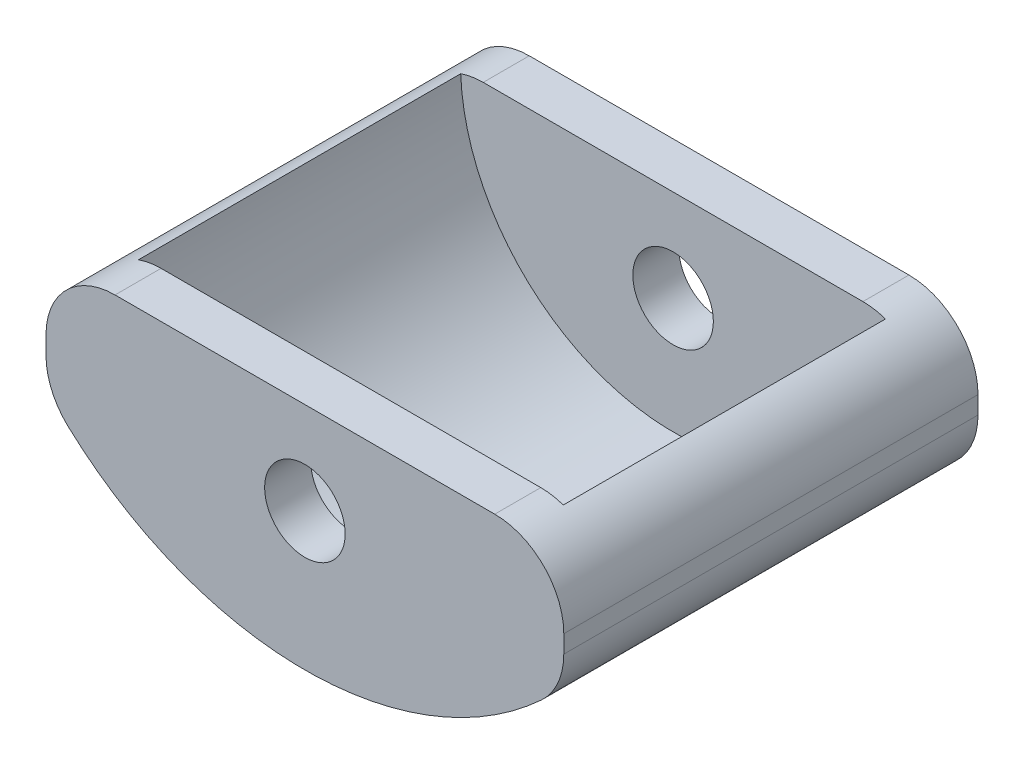
ISO-10303-21;
HEADER;
FILE_DESCRIPTION(('STEP AP214'),'2;1');
FILE_NAME('part.step','',(''),(''),'','','');
FILE_SCHEMA(('AUTOMOTIVE_DESIGN { 1 0 10303 214 1 1 1 1 }'));
ENDSEC;
DATA;
#1=APPLICATION_CONTEXT('core data for automotive mechanical design processes');
#2=APPLICATION_PROTOCOL_DEFINITION('international standard','automotive_design',2000,#1);
#3=PRODUCT_CONTEXT('',#1,'mechanical');
#4=PRODUCT('Part','Part','',(#3));
#5=PRODUCT_RELATED_PRODUCT_CATEGORY('part','',(#4));
#6=PRODUCT_DEFINITION_FORMATION('','',#4);
#7=PRODUCT_DEFINITION_CONTEXT('part definition',#1,'design');
#8=PRODUCT_DEFINITION('design','',#6,#7);
#9=PRODUCT_DEFINITION_SHAPE('','',#8);
#10=(LENGTH_UNIT() NAMED_UNIT(*) SI_UNIT(.MILLI.,.METRE.));
#11=(NAMED_UNIT(*) PLANE_ANGLE_UNIT() SI_UNIT($,.RADIAN.));
#12=(NAMED_UNIT(*) SI_UNIT($,.STERADIAN.) SOLID_ANGLE_UNIT());
#13=UNCERTAINTY_MEASURE_WITH_UNIT(LENGTH_MEASURE(1.E-05),#10,'distance_accuracy_value','');
#14=(GEOMETRIC_REPRESENTATION_CONTEXT(3) GLOBAL_UNCERTAINTY_ASSIGNED_CONTEXT((#13)) GLOBAL_UNIT_ASSIGNED_CONTEXT((#10,
#11,#12)) REPRESENTATION_CONTEXT('',''));
#15=CARTESIAN_POINT('',(0.,0.,0.));
#16=DIRECTION('',(0.,0.,1.));
#17=DIRECTION('',(1.,0.,0.));
#18=AXIS2_PLACEMENT_3D('',#15,#16,#17);
#19=CARTESIAN_POINT('',(0.,10.,0.));
#20=DIRECTION('',(0.,1.,0.));
#21=DIRECTION('',(0.,0.,1.));
#22=AXIS2_PLACEMENT_3D('',#19,#20,#21);
#23=PLANE('',#22);
#24=DIRECTION('',(1.,0.,0.));
#25=VECTOR('',#24,1.);
#26=CARTESIAN_POINT('',(-11.25,10.,9.));
#27=LINE('',#26,#25);
#28=CARTESIAN_POINT('',(-8.25,10.,9.));
#29=VERTEX_POINT('',#28);
#30=CARTESIAN_POINT('',(8.24999999999999,10.,9.));
#31=VERTEX_POINT('',#30);
#32=EDGE_CURVE('E210',#29,#31,#27,.T.);
#33=ORIENTED_EDGE('',*,*,#32,.T.);
#34=DIRECTION('',(0.,0.,-1.));
#35=VECTOR('',#34,1.);
#36=CARTESIAN_POINT('',(8.25,10.,-9.));
#37=LINE('',#36,#35);
#38=CARTESIAN_POINT('',(8.25,10.,7.));
#39=VERTEX_POINT('',#38);
#40=EDGE_CURVE('E182',#31,#39,#37,.T.);
#41=ORIENTED_EDGE('',*,*,#40,.T.);
#42=DIRECTION('',(1.,0.,0.));
#43=VECTOR('',#42,1.);
#44=CARTESIAN_POINT('',(0.,10.,7.));
#45=LINE('',#44,#43);
#46=CARTESIAN_POINT('',(-8.25,10.,7.));
#47=VERTEX_POINT('',#46);
#48=EDGE_CURVE('E212',#47,#39,#45,.T.);
#49=ORIENTED_EDGE('',*,*,#48,.F.);
#50=DIRECTION('',(0.,0.,1.));
#51=VECTOR('',#50,1.);
#52=CARTESIAN_POINT('',(-8.25,10.,9.));
#53=LINE('',#52,#51);
#54=EDGE_CURVE('E175',#47,#29,#53,.T.);
#55=ORIENTED_EDGE('',*,*,#54,.T.);
#56=EDGE_LOOP('',(#33,#41,#49,#55));
#57=FACE_BOUND('',#56,.T.);
#58=ADVANCED_FACE('F35',(#57),#23,.T.);
#59=CARTESIAN_POINT('',(0.,6.,-9.));
#60=DIRECTION('',(0.,0.,1.));
#61=DIRECTION('',(1.,0.,0.));
#62=AXIS2_PLACEMENT_3D('',#59,#60,#61);
#63=CYLINDRICAL_SURFACE('',#62,1.75);
#64=CARTESIAN_POINT('',(0.,6.,9.));
#65=DIRECTION('',(0.,0.,-1.));
#66=DIRECTION('',(-1.,0.,0.));
#67=AXIS2_PLACEMENT_3D('',#64,#65,#66);
#68=CIRCLE('',#67,1.75);
#69=CARTESIAN_POINT('',(-1.75,6.,9.));
#70=VERTEX_POINT('',#69);
#71=EDGE_CURVE('E220',#70,#70,#68,.T.);
#72=ORIENTED_EDGE('',*,*,#71,.F.);
#73=EDGE_LOOP('',(#72));
#74=FACE_BOUND('',#73,.T.);
#75=CARTESIAN_POINT('',(0.,6.,7.));
#76=DIRECTION('',(0.,0.,1.));
#77=DIRECTION('',(1.,0.,0.));
#78=AXIS2_PLACEMENT_3D('',#75,#76,#77);
#79=CIRCLE('',#78,1.75);
#80=CARTESIAN_POINT('',(1.75,6.,7.));
#81=VERTEX_POINT('',#80);
#82=EDGE_CURVE('E236',#81,#81,#79,.F.);
#83=ORIENTED_EDGE('',*,*,#82,.T.);
#84=EDGE_LOOP('',(#83));
#85=FACE_BOUND('',#84,.T.);
#86=ADVANCED_FACE('F250',(#74,#85),#63,.F.);
#87=DIRECTION('',(1.,0.,0.));
#88=VECTOR('',#87,1.);
#89=CARTESIAN_POINT('',(0.,10.,-7.));
#90=LINE('',#89,#88);
#91=CARTESIAN_POINT('',(-8.25000000000001,10.,-7.));
#92=VERTEX_POINT('',#91);
#93=CARTESIAN_POINT('',(8.25,10.,-7.));
#94=VERTEX_POINT('',#93);
#95=EDGE_CURVE('E291',#92,#94,#90,.T.);
#96=ORIENTED_EDGE('',*,*,#95,.T.);
#97=DIRECTION('',(0.,0.,-1.));
#98=VECTOR('',#97,1.);
#99=CARTESIAN_POINT('',(8.25,10.,-9.));
#100=LINE('',#99,#98);
#101=CARTESIAN_POINT('',(8.24999999999999,10.,-9.));
#102=VERTEX_POINT('',#101);
#103=EDGE_CURVE('E180',#94,#102,#100,.T.);
#104=ORIENTED_EDGE('',*,*,#103,.T.);
#105=DIRECTION('',(-1.,0.,0.));
#106=VECTOR('',#105,1.);
#107=CARTESIAN_POINT('',(-11.25,10.,-9.));
#108=LINE('',#107,#106);
#109=CARTESIAN_POINT('',(-8.25000000000001,10.,-9.));
#110=VERTEX_POINT('',#109);
#111=EDGE_CURVE('E219',#102,#110,#108,.T.);
#112=ORIENTED_EDGE('',*,*,#111,.T.);
#113=DIRECTION('',(0.,0.,1.));
#114=VECTOR('',#113,1.);
#115=CARTESIAN_POINT('',(-8.25,10.,9.));
#116=LINE('',#115,#114);
#117=EDGE_CURVE('E177',#110,#92,#116,.T.);
#118=ORIENTED_EDGE('',*,*,#117,.T.);
#119=EDGE_LOOP('',(#96,#104,#112,#118));
#120=FACE_BOUND('',#119,.T.);
#121=ADVANCED_FACE('F247',(#120),#23,.T.);
#122=CARTESIAN_POINT('',(0.,6.,-9.));
#123=DIRECTION('',(0.,0.,1.));
#124=DIRECTION('',(1.,0.,0.));
#125=AXIS2_PLACEMENT_3D('',#122,#123,#124);
#126=CIRCLE('',#125,1.75);
#127=CARTESIAN_POINT('',(1.75,6.,-9.));
#128=VERTEX_POINT('',#127);
#129=EDGE_CURVE('E146',#128,#128,#126,.T.);
#130=ORIENTED_EDGE('',*,*,#129,.F.);
#131=EDGE_LOOP('',(#130));
#132=FACE_BOUND('',#131,.T.);
#133=CARTESIAN_POINT('',(0.,6.,-7.));
#134=DIRECTION('',(0.,0.,1.));
#135=DIRECTION('',(1.,0.,0.));
#136=AXIS2_PLACEMENT_3D('',#133,#134,#135);
#137=CIRCLE('',#136,1.75);
#138=CARTESIAN_POINT('',(1.75,6.,-7.));
#139=VERTEX_POINT('',#138);
#140=EDGE_CURVE('E154',#139,#139,#137,.F.);
#141=ORIENTED_EDGE('',*,*,#140,.F.);
#142=EDGE_LOOP('',(#141));
#143=FACE_BOUND('',#142,.T.);
#144=ADVANCED_FACE('F244',(#132,#143),#63,.F.);
#145=CARTESIAN_POINT('',(-11.25,10.,-9.));
#146=DIRECTION('',(1.,0.,0.));
#147=DIRECTION('',(0.,0.,-1.));
#148=AXIS2_PLACEMENT_3D('',#145,#146,#147);
#149=PLANE('',#148);
#150=DIRECTION('',(0.,-1.,0.));
#151=VECTOR('',#150,1.);
#152=CARTESIAN_POINT('',(-11.25,10.,-9.));
#153=LINE('',#152,#151);
#154=CARTESIAN_POINT('',(-11.25,7.,-9.));
#155=VERTEX_POINT('',#154);
#156=CARTESIAN_POINT('',(-11.25,6.2307542689532,-9.));
#157=VERTEX_POINT('',#156);
#158=EDGE_CURVE('E223',#155,#157,#153,.T.);
#159=ORIENTED_EDGE('',*,*,#158,.T.);
#160=DIRECTION('',(0.,0.,1.));
#161=VECTOR('',#160,1.);
#162=CARTESIAN_POINT('',(-11.25,6.2307542689532,-9.));
#163=LINE('',#162,#161);
#164=CARTESIAN_POINT('',(-11.25,6.2307542689532,9.));
#165=VERTEX_POINT('',#164);
#166=EDGE_CURVE('E172',#157,#165,#163,.T.);
#167=ORIENTED_EDGE('',*,*,#166,.T.);
#168=DIRECTION('',(0.,-1.,0.));
#169=VECTOR('',#168,1.);
#170=CARTESIAN_POINT('',(-11.25,10.,9.));
#171=LINE('',#170,#169);
#172=CARTESIAN_POINT('',(-11.25,7.,9.));
#173=VERTEX_POINT('',#172);
#174=EDGE_CURVE('E234',#173,#165,#171,.T.);
#175=ORIENTED_EDGE('',*,*,#174,.F.);
#176=DIRECTION('',(0.,0.,1.));
#177=VECTOR('',#176,1.);
#178=CARTESIAN_POINT('',(-11.25,7.,-9.));
#179=LINE('',#178,#177);
#180=EDGE_CURVE('E134',#173,#155,#179,.F.);
#181=ORIENTED_EDGE('',*,*,#180,.T.);
#182=EDGE_LOOP('',(#159,#167,#175,#181));
#183=FACE_BOUND('',#182,.T.);
#184=ADVANCED_FACE('F246',(#183),#149,.F.);
#185=CARTESIAN_POINT('',(-11.25,10.,9.));
#186=DIRECTION('',(0.,0.,-1.));
#187=DIRECTION('',(-1.,0.,0.));
#188=AXIS2_PLACEMENT_3D('',#185,#186,#187);
#189=PLANE('',#188);
#190=ORIENTED_EDGE('',*,*,#71,.T.);
#191=EDGE_LOOP('',(#190));
#192=FACE_BOUND('',#191,.T.);
#193=CARTESIAN_POINT('',(0.,15.1866132264529,9.));
#194=DIRECTION('',(0.,0.,1.));
#195=DIRECTION('',(1.,0.,0.));
#196=AXIS2_PLACEMENT_3D('',#193,#194,#195);
#197=CIRCLE('',#196,15.1766132264529);
#198=CARTESIAN_POINT('',(10.2825848854452,4.02426414129347,9.));
#199=VERTEX_POINT('',#198);
#200=CARTESIAN_POINT('',(-10.2825848854452,4.02426414129347,9.));
#201=VERTEX_POINT('',#200);
#202=EDGE_CURVE('E145',#199,#201,#197,.F.);
#203=ORIENTED_EDGE('',*,*,#202,.F.);
#204=CARTESIAN_POINT('',(8.25,6.2307542689532,9.));
#205=DIRECTION('',(0.,0.,-1.));
#206=DIRECTION('',(-1.,0.,0.));
#207=AXIS2_PLACEMENT_3D('',#204,#205,#206);
#208=CIRCLE('',#207,3.);
#209=CARTESIAN_POINT('',(11.25,6.2307542689532,9.));
#210=VERTEX_POINT('',#209);
#211=EDGE_CURVE('E149',#199,#210,#208,.F.);
#212=ORIENTED_EDGE('',*,*,#211,.T.);
#213=DIRECTION('',(0.,-1.,0.));
#214=VECTOR('',#213,1.);
#215=CARTESIAN_POINT('',(11.25,10.,9.));
#216=LINE('',#215,#214);
#217=CARTESIAN_POINT('',(11.25,7.,9.));
#218=VERTEX_POINT('',#217);
#219=EDGE_CURVE('E231',#218,#210,#216,.T.);
#220=ORIENTED_EDGE('',*,*,#219,.F.);
#221=CARTESIAN_POINT('',(8.25,7.,9.));
#222=DIRECTION('',(0.,0.,-1.));
#223=DIRECTION('',(-1.,0.,0.));
#224=AXIS2_PLACEMENT_3D('',#221,#222,#223);
#225=CIRCLE('',#224,3.);
#226=EDGE_CURVE('E152',#218,#31,#225,.F.);
#227=ORIENTED_EDGE('',*,*,#226,.T.);
#228=ORIENTED_EDGE('',*,*,#32,.F.);
#229=CARTESIAN_POINT('',(-8.25,7.,9.));
#230=DIRECTION('',(0.,0.,-1.));
#231=DIRECTION('',(-1.,0.,0.));
#232=AXIS2_PLACEMENT_3D('',#229,#230,#231);
#233=CIRCLE('',#232,3.);
#234=EDGE_CURVE('E150',#29,#173,#233,.F.);
#235=ORIENTED_EDGE('',*,*,#234,.T.);
#236=ORIENTED_EDGE('',*,*,#174,.T.);
#237=CARTESIAN_POINT('',(-8.25,6.2307542689532,9.));
#238=DIRECTION('',(0.,0.,-1.));
#239=DIRECTION('',(-1.,0.,0.));
#240=AXIS2_PLACEMENT_3D('',#237,#238,#239);
#241=CIRCLE('',#240,3.);
#242=EDGE_CURVE('E159',#165,#201,#241,.F.);
#243=ORIENTED_EDGE('',*,*,#242,.T.);
#244=EDGE_LOOP('',(#203,#212,#220,#227,#228,#235,#236,#243));
#245=FACE_BOUND('',#244,.T.);
#246=ADVANCED_FACE('F214',(#192,#245),#189,.F.);
#247=CARTESIAN_POINT('',(11.25,10.,-9.));
#248=DIRECTION('',(-1.,0.,0.));
#249=DIRECTION('',(0.,0.,1.));
#250=AXIS2_PLACEMENT_3D('',#247,#248,#249);
#251=PLANE('',#250);
#252=ORIENTED_EDGE('',*,*,#219,.T.);
#253=DIRECTION('',(0.,0.,1.));
#254=VECTOR('',#253,1.);
#255=CARTESIAN_POINT('',(11.25,6.2307542689532,-9.));
#256=LINE('',#255,#254);
#257=CARTESIAN_POINT('',(11.25,6.2307542689532,-9.));
#258=VERTEX_POINT('',#257);
#259=EDGE_CURVE('E164',#210,#258,#256,.F.);
#260=ORIENTED_EDGE('',*,*,#259,.T.);
#261=DIRECTION('',(0.,-1.,0.));
#262=VECTOR('',#261,1.);
#263=CARTESIAN_POINT('',(11.25,10.,-9.));
#264=LINE('',#263,#262);
#265=CARTESIAN_POINT('',(11.25,7.,-9.));
#266=VERTEX_POINT('',#265);
#267=EDGE_CURVE('E130',#266,#258,#264,.T.);
#268=ORIENTED_EDGE('',*,*,#267,.F.);
#269=DIRECTION('',(0.,0.,-1.));
#270=VECTOR('',#269,1.);
#271=CARTESIAN_POINT('',(11.25,7.,9.));
#272=LINE('',#271,#270);
#273=EDGE_CURVE('E162',#266,#218,#272,.F.);
#274=ORIENTED_EDGE('',*,*,#273,.T.);
#275=EDGE_LOOP('',(#252,#260,#268,#274));
#276=FACE_BOUND('',#275,.T.);
#277=ADVANCED_FACE('F270',(#276),#251,.F.);
#278=CARTESIAN_POINT('',(-11.25,10.,-9.));
#279=DIRECTION('',(0.,0.,1.));
#280=DIRECTION('',(1.,0.,0.));
#281=AXIS2_PLACEMENT_3D('',#278,#279,#280);
#282=PLANE('',#281);
#283=ORIENTED_EDGE('',*,*,#129,.T.);
#284=EDGE_LOOP('',(#283));
#285=FACE_BOUND('',#284,.T.);
#286=ORIENTED_EDGE('',*,*,#267,.T.);
#287=CARTESIAN_POINT('',(8.25,6.2307542689532,-9.));
#288=DIRECTION('',(0.,0.,1.));
#289=DIRECTION('',(1.,0.,0.));
#290=AXIS2_PLACEMENT_3D('',#287,#288,#289);
#291=CIRCLE('',#290,3.);
#292=CARTESIAN_POINT('',(10.2825848854452,4.02426414129347,-9.));
#293=VERTEX_POINT('',#292);
#294=EDGE_CURVE('E124',#258,#293,#291,.F.);
#295=ORIENTED_EDGE('',*,*,#294,.T.);
#296=CARTESIAN_POINT('',(0.,15.1866132264529,-9.));
#297=DIRECTION('',(0.,0.,-1.));
#298=DIRECTION('',(1.,0.,0.));
#299=AXIS2_PLACEMENT_3D('',#296,#297,#298);
#300=CIRCLE('',#299,15.1766132264529);
#301=CARTESIAN_POINT('',(-10.2825848854452,4.02426414129347,-9.));
#302=VERTEX_POINT('',#301);
#303=EDGE_CURVE('E127',#293,#302,#300,.T.);
#304=ORIENTED_EDGE('',*,*,#303,.T.);
#305=CARTESIAN_POINT('',(-8.25,6.2307542689532,-9.));
#306=DIRECTION('',(0.,0.,1.));
#307=DIRECTION('',(1.,0.,0.));
#308=AXIS2_PLACEMENT_3D('',#305,#306,#307);
#309=CIRCLE('',#308,3.);
#310=EDGE_CURVE('E135',#302,#157,#309,.F.);
#311=ORIENTED_EDGE('',*,*,#310,.T.);
#312=ORIENTED_EDGE('',*,*,#158,.F.);
#313=CARTESIAN_POINT('',(-8.25,7.,-9.));
#314=DIRECTION('',(0.,0.,1.));
#315=DIRECTION('',(1.,0.,0.));
#316=AXIS2_PLACEMENT_3D('',#313,#314,#315);
#317=CIRCLE('',#316,3.);
#318=EDGE_CURVE('E166',#155,#110,#317,.F.);
#319=ORIENTED_EDGE('',*,*,#318,.T.);
#320=ORIENTED_EDGE('',*,*,#111,.F.);
#321=CARTESIAN_POINT('',(8.25,7.,-9.));
#322=DIRECTION('',(0.,0.,1.));
#323=DIRECTION('',(1.,0.,0.));
#324=AXIS2_PLACEMENT_3D('',#321,#322,#323);
#325=CIRCLE('',#324,3.);
#326=EDGE_CURVE('E168',#102,#266,#325,.F.);
#327=ORIENTED_EDGE('',*,*,#326,.T.);
#328=EDGE_LOOP('',(#286,#295,#304,#311,#312,#319,#320,#327));
#329=FACE_BOUND('',#328,.T.);
#330=ADVANCED_FACE('F126',(#285,#329),#282,.F.);
#331=CARTESIAN_POINT('',(0.,15.1866132264529,-9.));
#332=DIRECTION('',(0.,0.,1.));
#333=DIRECTION('',(1.,0.,0.));
#334=AXIS2_PLACEMENT_3D('',#331,#332,#333);
#335=CYLINDRICAL_SURFACE('',#334,15.1766132264529);
#336=ORIENTED_EDGE('',*,*,#303,.F.);
#337=DIRECTION('',(0.,0.,1.));
#338=VECTOR('',#337,1.);
#339=CARTESIAN_POINT('',(10.2825848854452,4.02426414129347,-9.));
#340=LINE('',#339,#338);
#341=EDGE_CURVE('E141',#293,#199,#340,.T.);
#342=ORIENTED_EDGE('',*,*,#341,.T.);
#343=ORIENTED_EDGE('',*,*,#202,.T.);
#344=DIRECTION('',(0.,0.,1.));
#345=VECTOR('',#344,1.);
#346=CARTESIAN_POINT('',(-10.2825848854452,4.02426414129347,-9.));
#347=LINE('',#346,#345);
#348=EDGE_CURVE('E144',#201,#302,#347,.F.);
#349=ORIENTED_EDGE('',*,*,#348,.T.);
#350=EDGE_LOOP('',(#336,#342,#343,#349));
#351=FACE_BOUND('',#350,.T.);
#352=ADVANCED_FACE('F139',(#351),#335,.T.);
#353=CARTESIAN_POINT('',(-3.75,10.1035611275534,-7.));
#354=DIRECTION('',(0.,0.,1.));
#355=DIRECTION('',(1.,0.,0.));
#356=AXIS2_PLACEMENT_3D('',#353,#354,#355);
#357=PLANE('',#356);
#358=ORIENTED_EDGE('',*,*,#140,.T.);
#359=EDGE_LOOP('',(#358));
#360=FACE_BOUND('',#359,.T.);
#361=CARTESIAN_POINT('',(0.,10.2071222551068,-7.));
#362=DIRECTION('',(0.,0.,1.));
#363=DIRECTION('',(1.,0.,0.));
#364=AXIS2_PLACEMENT_3D('',#361,#362,#363);
#365=CIRCLE('',#364,9.23746609130077);
#366=CARTESIAN_POINT('',(-9.22998484576561,9.83542407799429,-7.));
#367=VERTEX_POINT('',#366);
#368=CARTESIAN_POINT('',(9.22998484576561,9.83542407799429,-7.));
#369=VERTEX_POINT('',#368);
#370=EDGE_CURVE('E195',#367,#369,#365,.T.);
#371=ORIENTED_EDGE('',*,*,#370,.T.);
#372=CARTESIAN_POINT('',(8.25,7.,-7.));
#373=DIRECTION('',(0.,0.,1.));
#374=DIRECTION('',(1.,0.,0.));
#375=AXIS2_PLACEMENT_3D('',#372,#373,#374);
#376=CIRCLE('',#375,3.);
#377=EDGE_CURVE('E11',#369,#94,#376,.T.);
#378=ORIENTED_EDGE('',*,*,#377,.T.);
#379=ORIENTED_EDGE('',*,*,#95,.F.);
#380=CARTESIAN_POINT('',(-8.25,7.,-7.));
#381=DIRECTION('',(0.,0.,1.));
#382=DIRECTION('',(1.,0.,0.));
#383=AXIS2_PLACEMENT_3D('',#380,#381,#382);
#384=CIRCLE('',#383,3.);
#385=EDGE_CURVE('E43',#92,#367,#384,.T.);
#386=ORIENTED_EDGE('',*,*,#385,.T.);
#387=EDGE_LOOP('',(#371,#378,#379,#386));
#388=FACE_BOUND('',#387,.T.);
#389=ADVANCED_FACE('F242',(#360,#388),#357,.T.);
#390=CARTESIAN_POINT('',(-3.75,10.1035611275534,7.));
#391=DIRECTION('',(0.,0.,1.));
#392=DIRECTION('',(1.,0.,0.));
#393=AXIS2_PLACEMENT_3D('',#390,#391,#392);
#394=PLANE('',#393);
#395=ORIENTED_EDGE('',*,*,#82,.F.);
#396=EDGE_LOOP('',(#395));
#397=FACE_BOUND('',#396,.T.);
#398=ORIENTED_EDGE('',*,*,#48,.T.);
#399=CARTESIAN_POINT('',(8.25,7.,7.));
#400=DIRECTION('',(0.,0.,1.));
#401=DIRECTION('',(1.,0.,0.));
#402=AXIS2_PLACEMENT_3D('',#399,#400,#401);
#403=CIRCLE('',#402,3.);
#404=CARTESIAN_POINT('',(9.22998484576561,9.83542407799429,7.));
#405=VERTEX_POINT('',#404);
#406=EDGE_CURVE('E187',#39,#405,#403,.F.);
#407=ORIENTED_EDGE('',*,*,#406,.T.);
#408=CARTESIAN_POINT('',(0.,10.2071222551068,7.));
#409=DIRECTION('',(0.,0.,1.));
#410=DIRECTION('',(1.,0.,0.));
#411=AXIS2_PLACEMENT_3D('',#408,#409,#410);
#412=CIRCLE('',#411,9.23746609130077);
#413=CARTESIAN_POINT('',(-9.22998484576561,9.83542407799429,7.));
#414=VERTEX_POINT('',#413);
#415=EDGE_CURVE('E194',#414,#405,#412,.T.);
#416=ORIENTED_EDGE('',*,*,#415,.F.);
#417=CARTESIAN_POINT('',(-8.25,7.,7.));
#418=DIRECTION('',(0.,0.,1.));
#419=DIRECTION('',(1.,0.,0.));
#420=AXIS2_PLACEMENT_3D('',#417,#418,#419);
#421=CIRCLE('',#420,3.);
#422=EDGE_CURVE('E185',#414,#47,#421,.F.);
#423=ORIENTED_EDGE('',*,*,#422,.T.);
#424=EDGE_LOOP('',(#398,#407,#416,#423));
#425=FACE_BOUND('',#424,.T.);
#426=ADVANCED_FACE('F200',(#397,#425),#394,.F.);
#427=CARTESIAN_POINT('',(0.,10.2071222551068,-7.));
#428=DIRECTION('',(0.,0.,1.));
#429=DIRECTION('',(1.,0.,0.));
#430=AXIS2_PLACEMENT_3D('',#427,#428,#429);
#431=CYLINDRICAL_SURFACE('',#430,9.23746609130077);
#432=ORIENTED_EDGE('',*,*,#415,.T.);
#433=DIRECTION('',(0.,0.,1.));
#434=VECTOR('',#433,1.);
#435=CARTESIAN_POINT('',(9.22998484576561,9.83542407799429,7.));
#436=LINE('',#435,#434);
#437=EDGE_CURVE('E50',#405,#369,#436,.F.);
#438=ORIENTED_EDGE('',*,*,#437,.T.);
#439=ORIENTED_EDGE('',*,*,#370,.F.);
#440=DIRECTION('',(0.,0.,1.));
#441=VECTOR('',#440,1.);
#442=CARTESIAN_POINT('',(-9.22998484576561,9.83542407799429,-7.));
#443=LINE('',#442,#441);
#444=EDGE_CURVE('E189',#367,#414,#443,.T.);
#445=ORIENTED_EDGE('',*,*,#444,.T.);
#446=EDGE_LOOP('',(#432,#438,#439,#445));
#447=FACE_BOUND('',#446,.T.);
#448=ADVANCED_FACE('F193',(#447),#431,.F.);
#449=CARTESIAN_POINT('',(8.25,6.2307542689532,-9.));
#450=DIRECTION('',(0.,0.,1.));
#451=DIRECTION('',(1.,0.,0.));
#452=AXIS2_PLACEMENT_3D('',#449,#450,#451);
#453=CYLINDRICAL_SURFACE('',#452,3.);
#454=ORIENTED_EDGE('',*,*,#294,.F.);
#455=ORIENTED_EDGE('',*,*,#259,.F.);
#456=ORIENTED_EDGE('',*,*,#211,.F.);
#457=ORIENTED_EDGE('',*,*,#341,.F.);
#458=EDGE_LOOP('',(#454,#455,#456,#457));
#459=FACE_BOUND('',#458,.T.);
#460=ADVANCED_FACE('F148',(#459),#453,.T.);
#461=CARTESIAN_POINT('',(-8.25,6.2307542689532,-9.));
#462=DIRECTION('',(0.,0.,1.));
#463=DIRECTION('',(1.,0.,0.));
#464=AXIS2_PLACEMENT_3D('',#461,#462,#463);
#465=CYLINDRICAL_SURFACE('',#464,3.);
#466=ORIENTED_EDGE('',*,*,#310,.F.);
#467=ORIENTED_EDGE('',*,*,#348,.F.);
#468=ORIENTED_EDGE('',*,*,#242,.F.);
#469=ORIENTED_EDGE('',*,*,#166,.F.);
#470=EDGE_LOOP('',(#466,#467,#468,#469));
#471=FACE_BOUND('',#470,.T.);
#472=ADVANCED_FACE('F280',(#471),#465,.T.);
#473=CARTESIAN_POINT('',(8.25,7.,0.));
#474=DIRECTION('',(0.,0.,1.));
#475=DIRECTION('',(1.,0.,0.));
#476=AXIS2_PLACEMENT_3D('',#473,#474,#475);
#477=CYLINDRICAL_SURFACE('',#476,3.);
#478=ORIENTED_EDGE('',*,*,#226,.F.);
#479=ORIENTED_EDGE('',*,*,#273,.F.);
#480=ORIENTED_EDGE('',*,*,#326,.F.);
#481=ORIENTED_EDGE('',*,*,#103,.F.);
#482=ORIENTED_EDGE('',*,*,#377,.F.);
#483=ORIENTED_EDGE('',*,*,#437,.F.);
#484=ORIENTED_EDGE('',*,*,#406,.F.);
#485=ORIENTED_EDGE('',*,*,#40,.F.);
#486=EDGE_LOOP('',(#478,#479,#480,#481,#482,#483,#484,#485));
#487=FACE_BOUND('',#486,.T.);
#488=ADVANCED_FACE('F282',(#487),#477,.T.);
#489=CARTESIAN_POINT('',(-8.25,7.,0.));
#490=DIRECTION('',(0.,0.,-1.));
#491=DIRECTION('',(-1.,0.,0.));
#492=AXIS2_PLACEMENT_3D('',#489,#490,#491);
#493=CYLINDRICAL_SURFACE('',#492,3.);
#494=ORIENTED_EDGE('',*,*,#318,.F.);
#495=ORIENTED_EDGE('',*,*,#180,.F.);
#496=ORIENTED_EDGE('',*,*,#234,.F.);
#497=ORIENTED_EDGE('',*,*,#54,.F.);
#498=ORIENTED_EDGE('',*,*,#422,.F.);
#499=ORIENTED_EDGE('',*,*,#444,.F.);
#500=ORIENTED_EDGE('',*,*,#385,.F.);
#501=ORIENTED_EDGE('',*,*,#117,.F.);
#502=EDGE_LOOP('',(#494,#495,#496,#497,#498,#499,#500,#501));
#503=FACE_BOUND('',#502,.T.);
#504=ADVANCED_FACE('F37',(#503),#493,.T.);
#505=CLOSED_SHELL('',(#58,#86,#121,#144,#184,#246,#277,#330,#352,#389,#426,#448,#460,#472,#488,#504));
#506=MANIFOLD_SOLID_BREP('B2',#505);
#507=ADVANCED_BREP_SHAPE_REPRESENTATION('',(#18,#506),#14);
#508=SHAPE_DEFINITION_REPRESENTATION(#9,#507);
ENDSEC;
END-ISO-10303-21;
